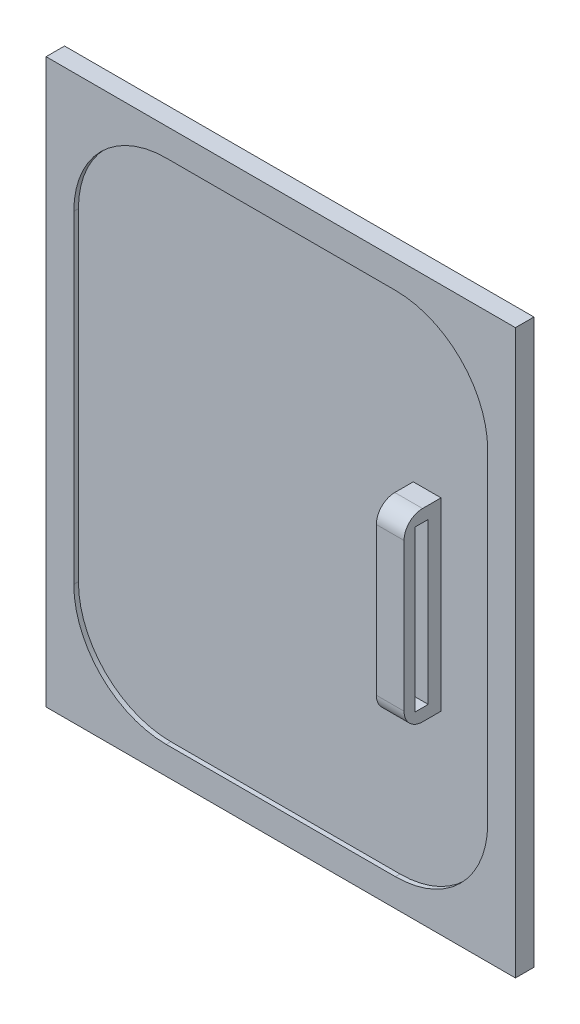
ISO-10303-21;
HEADER;
FILE_DESCRIPTION(('STEP AP214'),'2;1');
FILE_NAME('part.step','',(''),(''),'','','');
FILE_SCHEMA(('AUTOMOTIVE_DESIGN { 1 0 10303 214 1 1 1 1 }'));
ENDSEC;
DATA;
#1=APPLICATION_CONTEXT('core data for automotive mechanical design processes');
#2=APPLICATION_PROTOCOL_DEFINITION('international standard','automotive_design',2000,#1);
#3=PRODUCT_CONTEXT('',#1,'mechanical');
#4=PRODUCT('Part','Part','',(#3));
#5=PRODUCT_RELATED_PRODUCT_CATEGORY('part','',(#4));
#6=PRODUCT_DEFINITION_FORMATION('','',#4);
#7=PRODUCT_DEFINITION_CONTEXT('part definition',#1,'design');
#8=PRODUCT_DEFINITION('design','',#6,#7);
#9=PRODUCT_DEFINITION_SHAPE('','',#8);
#10=(LENGTH_UNIT() NAMED_UNIT(*) SI_UNIT(.MILLI.,.METRE.));
#11=(NAMED_UNIT(*) PLANE_ANGLE_UNIT() SI_UNIT($,.RADIAN.));
#12=(NAMED_UNIT(*) SI_UNIT($,.STERADIAN.) SOLID_ANGLE_UNIT());
#13=UNCERTAINTY_MEASURE_WITH_UNIT(LENGTH_MEASURE(1.E-05),#10,'distance_accuracy_value','');
#14=(GEOMETRIC_REPRESENTATION_CONTEXT(3) GLOBAL_UNCERTAINTY_ASSIGNED_CONTEXT((#13)) GLOBAL_UNIT_ASSIGNED_CONTEXT((#10,
#11,#12)) REPRESENTATION_CONTEXT('',''));
#15=CARTESIAN_POINT('',(0.,0.,0.));
#16=DIRECTION('',(0.,0.,1.));
#17=DIRECTION('',(1.,0.,0.));
#18=AXIS2_PLACEMENT_3D('',#15,#16,#17);
#19=CARTESIAN_POINT('',(-62.0000000000001,-87.4,7.5));
#20=DIRECTION('',(0.,0.,-1.));
#21=DIRECTION('',(-1.,0.,0.));
#22=AXIS2_PLACEMENT_3D('',#19,#20,#21);
#23=PLANE('',#22);
#24=CARTESIAN_POINT('',(-62.0000000000001,-87.4,7.5));
#25=DIRECTION('',(0.,0.,1.));
#26=DIRECTION('',(-1.,0.,0.));
#27=AXIS2_PLACEMENT_3D('',#24,#25,#26);
#28=CIRCLE('',#27,50.);
#29=CARTESIAN_POINT('',(-112.,-87.3999999999997,7.5));
#30=VERTEX_POINT('',#29);
#31=CARTESIAN_POINT('',(-61.9999999999997,-137.4,7.5));
#32=VERTEX_POINT('',#31);
#33=EDGE_CURVE('E247',#30,#32,#28,.T.);
#34=ORIENTED_EDGE('',*,*,#33,.T.);
#35=DIRECTION('',(1.,0.,0.));
#36=VECTOR('',#35,1.);
#37=CARTESIAN_POINT('',(-61.9999999999997,-137.4,7.5));
#38=LINE('',#37,#36);
#39=CARTESIAN_POINT('',(61.9999999999997,-137.4,7.5));
#40=VERTEX_POINT('',#39);
#41=EDGE_CURVE('E250',#32,#40,#38,.T.);
#42=ORIENTED_EDGE('',*,*,#41,.T.);
#43=CARTESIAN_POINT('',(62.,-87.4,7.5));
#44=DIRECTION('',(0.,0.,1.));
#45=DIRECTION('',(1.,0.,0.));
#46=AXIS2_PLACEMENT_3D('',#43,#44,#45);
#47=CIRCLE('',#46,50.);
#48=CARTESIAN_POINT('',(112.,-87.4,7.5));
#49=VERTEX_POINT('',#48);
#50=EDGE_CURVE('E254',#40,#49,#47,.T.);
#51=ORIENTED_EDGE('',*,*,#50,.T.);
#52=DIRECTION('',(0.,1.,0.));
#53=VECTOR('',#52,1.);
#54=CARTESIAN_POINT('',(112.,-87.3999999999997,7.5));
#55=LINE('',#54,#53);
#56=CARTESIAN_POINT('',(112.,87.3999999999997,7.5));
#57=VERTEX_POINT('',#56);
#58=EDGE_CURVE('E257',#49,#57,#55,.T.);
#59=ORIENTED_EDGE('',*,*,#58,.T.);
#60=CARTESIAN_POINT('',(62.,87.4,7.5));
#61=DIRECTION('',(0.,0.,1.));
#62=DIRECTION('',(-1.,0.,0.));
#63=AXIS2_PLACEMENT_3D('',#60,#61,#62);
#64=CIRCLE('',#63,50.);
#65=CARTESIAN_POINT('',(61.9999999999997,137.4,7.5));
#66=VERTEX_POINT('',#65);
#67=EDGE_CURVE('E260',#57,#66,#64,.T.);
#68=ORIENTED_EDGE('',*,*,#67,.T.);
#69=DIRECTION('',(-1.,0.,0.));
#70=VECTOR('',#69,1.);
#71=CARTESIAN_POINT('',(-61.9999999999997,137.4,7.5));
#72=LINE('',#71,#70);
#73=CARTESIAN_POINT('',(-61.9999999999997,137.4,7.5));
#74=VERTEX_POINT('',#73);
#75=EDGE_CURVE('E263',#66,#74,#72,.T.);
#76=ORIENTED_EDGE('',*,*,#75,.T.);
#77=CARTESIAN_POINT('',(-62.0000000000001,87.4,7.5));
#78=DIRECTION('',(0.,0.,1.));
#79=DIRECTION('',(-1.,0.,0.));
#80=AXIS2_PLACEMENT_3D('',#77,#78,#79);
#81=CIRCLE('',#80,50.);
#82=CARTESIAN_POINT('',(-112.,87.3999999999997,7.5));
#83=VERTEX_POINT('',#82);
#84=EDGE_CURVE('E266',#74,#83,#81,.T.);
#85=ORIENTED_EDGE('',*,*,#84,.T.);
#86=DIRECTION('',(0.,-1.,0.));
#87=VECTOR('',#86,1.);
#88=CARTESIAN_POINT('',(-112.,-87.3999999999997,7.5));
#89=LINE('',#88,#87);
#90=EDGE_CURVE('E269',#83,#30,#89,.T.);
#91=ORIENTED_EDGE('',*,*,#90,.T.);
#92=EDGE_LOOP('',(#34,#42,#51,#59,#68,#76,#85,#91));
#93=FACE_BOUND('',#92,.T.);
#94=DIRECTION('',(0.,1.,0.));
#95=VECTOR('',#94,1.);
#96=CARTESIAN_POINT('',(84.2187120964874,-49.9999999999999,7.5));
#97=LINE('',#96,#95);
#98=CARTESIAN_POINT('',(84.2187120964874,-49.9999999999999,7.5));
#99=VERTEX_POINT('',#98);
#100=CARTESIAN_POINT('',(84.2187120964874,50.0000000000001,7.5));
#101=VERTEX_POINT('',#100);
#102=EDGE_CURVE('E220',#99,#101,#97,.T.);
#103=ORIENTED_EDGE('',*,*,#102,.F.);
#104=DIRECTION('',(1.,0.,0.));
#105=VECTOR('',#104,1.);
#106=CARTESIAN_POINT('',(69.2187120964874,-49.9999999999999,7.5));
#107=LINE('',#106,#105);
#108=CARTESIAN_POINT('',(69.2187120964874,-49.9999999999999,7.5));
#109=VERTEX_POINT('',#108);
#110=EDGE_CURVE('E225',#109,#99,#107,.T.);
#111=ORIENTED_EDGE('',*,*,#110,.F.);
#112=DIRECTION('',(0.,-1.,0.));
#113=VECTOR('',#112,1.);
#114=CARTESIAN_POINT('',(69.2187120964874,-49.9999999999999,7.5));
#115=LINE('',#114,#113);
#116=CARTESIAN_POINT('',(69.2187120964874,50.0000000000001,7.5));
#117=VERTEX_POINT('',#116);
#118=EDGE_CURVE('E234',#117,#109,#115,.T.);
#119=ORIENTED_EDGE('',*,*,#118,.F.);
#120=DIRECTION('',(-1.,0.,0.));
#121=VECTOR('',#120,1.);
#122=CARTESIAN_POINT('',(69.2187120964874,50.0000000000001,7.5));
#123=LINE('',#122,#121);
#124=EDGE_CURVE('E231',#101,#117,#123,.T.);
#125=ORIENTED_EDGE('',*,*,#124,.F.);
#126=EDGE_LOOP('',(#103,#111,#119,#125));
#127=FACE_BOUND('',#126,.T.);
#128=ADVANCED_FACE('F39',(#93,#127),#23,.F.);
#129=CARTESIAN_POINT('',(127.,-152.4,10.));
#130=DIRECTION('',(-1.,0.,0.));
#131=DIRECTION('',(0.,0.,1.));
#132=AXIS2_PLACEMENT_3D('',#129,#130,#131);
#133=PLANE('',#132);
#134=DIRECTION('',(0.,1.,0.));
#135=VECTOR('',#134,1.);
#136=CARTESIAN_POINT('',(127.,-152.4,0.));
#137=LINE('',#136,#135);
#138=CARTESIAN_POINT('',(127.,-152.4,0.));
#139=VERTEX_POINT('',#138);
#140=CARTESIAN_POINT('',(127.,152.4,0.));
#141=VERTEX_POINT('',#140);
#142=EDGE_CURVE('E296',#139,#141,#137,.T.);
#143=ORIENTED_EDGE('',*,*,#142,.T.);
#144=DIRECTION('',(0.,0.,-1.));
#145=VECTOR('',#144,1.);
#146=CARTESIAN_POINT('',(127.,152.4,10.));
#147=LINE('',#146,#145);
#148=CARTESIAN_POINT('',(127.,152.4,10.));
#149=VERTEX_POINT('',#148);
#150=EDGE_CURVE('E337',#149,#141,#147,.T.);
#151=ORIENTED_EDGE('',*,*,#150,.F.);
#152=DIRECTION('',(0.,1.,0.));
#153=VECTOR('',#152,1.);
#154=CARTESIAN_POINT('',(127.,-152.4,10.));
#155=LINE('',#154,#153);
#156=CARTESIAN_POINT('',(127.,-152.4,10.));
#157=VERTEX_POINT('',#156);
#158=EDGE_CURVE('E311',#157,#149,#155,.T.);
#159=ORIENTED_EDGE('',*,*,#158,.F.);
#160=DIRECTION('',(0.,0.,-1.));
#161=VECTOR('',#160,1.);
#162=CARTESIAN_POINT('',(127.,-152.4,10.));
#163=LINE('',#162,#161);
#164=EDGE_CURVE('E321',#157,#139,#163,.T.);
#165=ORIENTED_EDGE('',*,*,#164,.T.);
#166=EDGE_LOOP('',(#143,#151,#159,#165));
#167=FACE_BOUND('',#166,.T.);
#168=ADVANCED_FACE('F385',(#167),#133,.F.);
#169=CARTESIAN_POINT('',(-127.,152.4,10.));
#170=DIRECTION('',(0.,-1.,0.));
#171=DIRECTION('',(0.,0.,-1.));
#172=AXIS2_PLACEMENT_3D('',#169,#170,#171);
#173=PLANE('',#172);
#174=DIRECTION('',(-1.,0.,0.));
#175=VECTOR('',#174,1.);
#176=CARTESIAN_POINT('',(-127.,152.4,0.));
#177=LINE('',#176,#175);
#178=CARTESIAN_POINT('',(-127.,152.4,0.));
#179=VERTEX_POINT('',#178);
#180=EDGE_CURVE('E324',#141,#179,#177,.T.);
#181=ORIENTED_EDGE('',*,*,#180,.T.);
#182=DIRECTION('',(0.,0.,-1.));
#183=VECTOR('',#182,1.);
#184=CARTESIAN_POINT('',(-127.,152.4,10.));
#185=LINE('',#184,#183);
#186=CARTESIAN_POINT('',(-127.,152.4,10.));
#187=VERTEX_POINT('',#186);
#188=EDGE_CURVE('E334',#187,#179,#185,.T.);
#189=ORIENTED_EDGE('',*,*,#188,.F.);
#190=DIRECTION('',(-1.,0.,0.));
#191=VECTOR('',#190,1.);
#192=CARTESIAN_POINT('',(-127.,152.4,10.));
#193=LINE('',#192,#191);
#194=EDGE_CURVE('E314',#149,#187,#193,.T.);
#195=ORIENTED_EDGE('',*,*,#194,.F.);
#196=ORIENTED_EDGE('',*,*,#150,.T.);
#197=EDGE_LOOP('',(#181,#189,#195,#196));
#198=FACE_BOUND('',#197,.T.);
#199=ADVANCED_FACE('F393',(#198),#173,.F.);
#200=CARTESIAN_POINT('',(-127.,-152.4,10.));
#201=DIRECTION('',(1.,0.,0.));
#202=DIRECTION('',(0.,0.,-1.));
#203=AXIS2_PLACEMENT_3D('',#200,#201,#202);
#204=PLANE('',#203);
#205=DIRECTION('',(0.,-1.,0.));
#206=VECTOR('',#205,1.);
#207=CARTESIAN_POINT('',(-127.,-152.4,0.));
#208=LINE('',#207,#206);
#209=CARTESIAN_POINT('',(-127.,-152.4,0.));
#210=VERTEX_POINT('',#209);
#211=EDGE_CURVE('E326',#179,#210,#208,.T.);
#212=ORIENTED_EDGE('',*,*,#211,.T.);
#213=DIRECTION('',(0.,0.,-1.));
#214=VECTOR('',#213,1.);
#215=CARTESIAN_POINT('',(-127.,-152.4,10.));
#216=LINE('',#215,#214);
#217=CARTESIAN_POINT('',(-127.,-152.4,10.));
#218=VERTEX_POINT('',#217);
#219=EDGE_CURVE('E331',#218,#210,#216,.T.);
#220=ORIENTED_EDGE('',*,*,#219,.F.);
#221=DIRECTION('',(0.,-1.,0.));
#222=VECTOR('',#221,1.);
#223=CARTESIAN_POINT('',(-127.,-152.4,10.));
#224=LINE('',#223,#222);
#225=EDGE_CURVE('E317',#187,#218,#224,.T.);
#226=ORIENTED_EDGE('',*,*,#225,.F.);
#227=ORIENTED_EDGE('',*,*,#188,.T.);
#228=EDGE_LOOP('',(#212,#220,#226,#227));
#229=FACE_BOUND('',#228,.T.);
#230=ADVANCED_FACE('F441',(#229),#204,.F.);
#231=CARTESIAN_POINT('',(-127.,-152.4,10.));
#232=DIRECTION('',(0.,1.,0.));
#233=DIRECTION('',(0.,0.,1.));
#234=AXIS2_PLACEMENT_3D('',#231,#232,#233);
#235=PLANE('',#234);
#236=DIRECTION('',(1.,0.,0.));
#237=VECTOR('',#236,1.);
#238=CARTESIAN_POINT('',(-127.,-152.4,0.));
#239=LINE('',#238,#237);
#240=EDGE_CURVE('E315',#210,#139,#239,.T.);
#241=ORIENTED_EDGE('',*,*,#240,.T.);
#242=ORIENTED_EDGE('',*,*,#164,.F.);
#243=DIRECTION('',(1.,0.,0.));
#244=VECTOR('',#243,1.);
#245=CARTESIAN_POINT('',(-127.,-152.4,10.));
#246=LINE('',#245,#244);
#247=EDGE_CURVE('E319',#218,#157,#246,.T.);
#248=ORIENTED_EDGE('',*,*,#247,.F.);
#249=ORIENTED_EDGE('',*,*,#219,.T.);
#250=EDGE_LOOP('',(#241,#242,#248,#249));
#251=FACE_BOUND('',#250,.T.);
#252=ADVANCED_FACE('F434',(#251),#235,.F.);
#253=CARTESIAN_POINT('',(0.,0.,10.));
#254=DIRECTION('',(0.,0.,-1.));
#255=DIRECTION('',(-1.,0.,0.));
#256=AXIS2_PLACEMENT_3D('',#253,#254,#255);
#257=PLANE('',#256);
#258=DIRECTION('',(1.,0.,0.));
#259=VECTOR('',#258,1.);
#260=CARTESIAN_POINT('',(-61.9999999999997,-137.4,10.));
#261=LINE('',#260,#259);
#262=CARTESIAN_POINT('',(-61.9999999999997,-137.4,10.));
#263=VERTEX_POINT('',#262);
#264=CARTESIAN_POINT('',(61.9999999999997,-137.4,10.));
#265=VERTEX_POINT('',#264);
#266=EDGE_CURVE('E274',#263,#265,#261,.T.);
#267=ORIENTED_EDGE('',*,*,#266,.F.);
#268=CARTESIAN_POINT('',(-62.0000000000001,-87.4,10.));
#269=DIRECTION('',(0.,0.,1.));
#270=DIRECTION('',(-1.,0.,0.));
#271=AXIS2_PLACEMENT_3D('',#268,#269,#270);
#272=CIRCLE('',#271,50.);
#273=CARTESIAN_POINT('',(-112.,-87.3999999999997,10.));
#274=VERTEX_POINT('',#273);
#275=EDGE_CURVE('E246',#274,#263,#272,.T.);
#276=ORIENTED_EDGE('',*,*,#275,.F.);
#277=DIRECTION('',(0.,-1.,0.));
#278=VECTOR('',#277,1.);
#279=CARTESIAN_POINT('',(-112.,-87.3999999999997,10.));
#280=LINE('',#279,#278);
#281=CARTESIAN_POINT('',(-112.,87.3999999999997,10.));
#282=VERTEX_POINT('',#281);
#283=EDGE_CURVE('E251',#282,#274,#280,.T.);
#284=ORIENTED_EDGE('',*,*,#283,.F.);
#285=CARTESIAN_POINT('',(-62.0000000000001,87.4,10.));
#286=DIRECTION('',(0.,0.,1.));
#287=DIRECTION('',(-1.,0.,0.));
#288=AXIS2_PLACEMENT_3D('',#285,#286,#287);
#289=CIRCLE('',#288,50.);
#290=CARTESIAN_POINT('',(-61.9999999999997,137.4,10.));
#291=VERTEX_POINT('',#290);
#292=EDGE_CURVE('E289',#291,#282,#289,.T.);
#293=ORIENTED_EDGE('',*,*,#292,.F.);
#294=DIRECTION('',(-1.,0.,0.));
#295=VECTOR('',#294,1.);
#296=CARTESIAN_POINT('',(-61.9999999999997,137.4,10.));
#297=LINE('',#296,#295);
#298=CARTESIAN_POINT('',(61.9999999999997,137.4,10.));
#299=VERTEX_POINT('',#298);
#300=EDGE_CURVE('E286',#299,#291,#297,.T.);
#301=ORIENTED_EDGE('',*,*,#300,.F.);
#302=CARTESIAN_POINT('',(62.,87.4,10.));
#303=DIRECTION('',(0.,0.,1.));
#304=DIRECTION('',(-1.,0.,0.));
#305=AXIS2_PLACEMENT_3D('',#302,#303,#304);
#306=CIRCLE('',#305,50.);
#307=CARTESIAN_POINT('',(112.,87.3999999999997,10.));
#308=VERTEX_POINT('',#307);
#309=EDGE_CURVE('E283',#308,#299,#306,.T.);
#310=ORIENTED_EDGE('',*,*,#309,.F.);
#311=DIRECTION('',(0.,1.,0.));
#312=VECTOR('',#311,1.);
#313=CARTESIAN_POINT('',(112.,-87.3999999999997,10.));
#314=LINE('',#313,#312);
#315=CARTESIAN_POINT('',(112.,-87.4,10.));
#316=VERTEX_POINT('',#315);
#317=EDGE_CURVE('E280',#316,#308,#314,.T.);
#318=ORIENTED_EDGE('',*,*,#317,.F.);
#319=CARTESIAN_POINT('',(62.,-87.4,10.));
#320=DIRECTION('',(0.,0.,1.));
#321=DIRECTION('',(1.,0.,0.));
#322=AXIS2_PLACEMENT_3D('',#319,#320,#321);
#323=CIRCLE('',#322,50.);
#324=EDGE_CURVE('E277',#265,#316,#323,.T.);
#325=ORIENTED_EDGE('',*,*,#324,.F.);
#326=EDGE_LOOP('',(#267,#276,#284,#293,#301,#310,#318,#325));
#327=FACE_BOUND('',#326,.T.);
#328=ORIENTED_EDGE('',*,*,#158,.T.);
#329=ORIENTED_EDGE('',*,*,#194,.T.);
#330=ORIENTED_EDGE('',*,*,#225,.T.);
#331=ORIENTED_EDGE('',*,*,#247,.T.);
#332=EDGE_LOOP('',(#328,#329,#330,#331));
#333=FACE_BOUND('',#332,.T.);
#334=ADVANCED_FACE('F431',(#327,#333),#257,.F.);
#335=CARTESIAN_POINT('',(0.,0.,0.));
#336=DIRECTION('',(0.,0.,-1.));
#337=DIRECTION('',(-1.,0.,0.));
#338=AXIS2_PLACEMENT_3D('',#335,#336,#337);
#339=PLANE('',#338);
#340=ORIENTED_EDGE('',*,*,#142,.F.);
#341=ORIENTED_EDGE('',*,*,#240,.F.);
#342=ORIENTED_EDGE('',*,*,#211,.F.);
#343=ORIENTED_EDGE('',*,*,#180,.F.);
#344=EDGE_LOOP('',(#340,#341,#342,#343));
#345=FACE_BOUND('',#344,.T.);
#346=ADVANCED_FACE('F429',(#345),#339,.T.);
#347=CARTESIAN_POINT('',(-62.0000000000001,-87.4,7.5));
#348=DIRECTION('',(0.,0.,1.));
#349=DIRECTION('',(1.,0.,0.));
#350=AXIS2_PLACEMENT_3D('',#347,#348,#349);
#351=CYLINDRICAL_SURFACE('',#350,50.);
#352=ORIENTED_EDGE('',*,*,#275,.T.);
#353=DIRECTION('',(0.,0.,1.));
#354=VECTOR('',#353,1.);
#355=CARTESIAN_POINT('',(-61.9999999999997,-137.4,7.5));
#356=LINE('',#355,#354);
#357=EDGE_CURVE('E272',#32,#263,#356,.T.);
#358=ORIENTED_EDGE('',*,*,#357,.F.);
#359=ORIENTED_EDGE('',*,*,#33,.F.);
#360=DIRECTION('',(0.,0.,1.));
#361=VECTOR('',#360,1.);
#362=CARTESIAN_POINT('',(-112.,-87.3999999999997,7.5));
#363=LINE('',#362,#361);
#364=EDGE_CURVE('E294',#30,#274,#363,.T.);
#365=ORIENTED_EDGE('',*,*,#364,.T.);
#366=EDGE_LOOP('',(#352,#358,#359,#365));
#367=FACE_BOUND('',#366,.T.);
#368=ADVANCED_FACE('F403',(#367),#351,.F.);
#369=CARTESIAN_POINT('',(-112.,-87.3999999999997,7.5));
#370=DIRECTION('',(-1.,0.,0.));
#371=DIRECTION('',(0.,0.,1.));
#372=AXIS2_PLACEMENT_3D('',#369,#370,#371);
#373=PLANE('',#372);
#374=ORIENTED_EDGE('',*,*,#283,.T.);
#375=ORIENTED_EDGE('',*,*,#364,.F.);
#376=ORIENTED_EDGE('',*,*,#90,.F.);
#377=DIRECTION('',(0.,0.,1.));
#378=VECTOR('',#377,1.);
#379=CARTESIAN_POINT('',(-112.,87.3999999999997,7.5));
#380=LINE('',#379,#378);
#381=EDGE_CURVE('E297',#83,#282,#380,.T.);
#382=ORIENTED_EDGE('',*,*,#381,.T.);
#383=EDGE_LOOP('',(#374,#375,#376,#382));
#384=FACE_BOUND('',#383,.T.);
#385=ADVANCED_FACE('F399',(#384),#373,.F.);
#386=CARTESIAN_POINT('',(-62.0000000000001,87.4,7.5));
#387=DIRECTION('',(0.,0.,1.));
#388=DIRECTION('',(1.,0.,0.));
#389=AXIS2_PLACEMENT_3D('',#386,#387,#388);
#390=CYLINDRICAL_SURFACE('',#389,50.);
#391=ORIENTED_EDGE('',*,*,#292,.T.);
#392=ORIENTED_EDGE('',*,*,#381,.F.);
#393=ORIENTED_EDGE('',*,*,#84,.F.);
#394=DIRECTION('',(0.,0.,1.));
#395=VECTOR('',#394,1.);
#396=CARTESIAN_POINT('',(-61.9999999999997,137.4,7.5));
#397=LINE('',#396,#395);
#398=EDGE_CURVE('E299',#74,#291,#397,.T.);
#399=ORIENTED_EDGE('',*,*,#398,.T.);
#400=EDGE_LOOP('',(#391,#392,#393,#399));
#401=FACE_BOUND('',#400,.T.);
#402=ADVANCED_FACE('F402',(#401),#390,.F.);
#403=CARTESIAN_POINT('',(-61.9999999999997,137.4,7.5));
#404=DIRECTION('',(0.,1.,0.));
#405=DIRECTION('',(0.,0.,1.));
#406=AXIS2_PLACEMENT_3D('',#403,#404,#405);
#407=PLANE('',#406);
#408=ORIENTED_EDGE('',*,*,#300,.T.);
#409=ORIENTED_EDGE('',*,*,#398,.F.);
#410=ORIENTED_EDGE('',*,*,#75,.F.);
#411=DIRECTION('',(0.,0.,1.));
#412=VECTOR('',#411,1.);
#413=CARTESIAN_POINT('',(61.9999999999997,137.4,7.5));
#414=LINE('',#413,#412);
#415=EDGE_CURVE('E301',#66,#299,#414,.T.);
#416=ORIENTED_EDGE('',*,*,#415,.T.);
#417=EDGE_LOOP('',(#408,#409,#410,#416));
#418=FACE_BOUND('',#417,.T.);
#419=ADVANCED_FACE('F407',(#418),#407,.F.);
#420=CARTESIAN_POINT('',(62.,87.4,7.5));
#421=DIRECTION('',(0.,0.,1.));
#422=DIRECTION('',(1.,0.,0.));
#423=AXIS2_PLACEMENT_3D('',#420,#421,#422);
#424=CYLINDRICAL_SURFACE('',#423,50.);
#425=ORIENTED_EDGE('',*,*,#309,.T.);
#426=ORIENTED_EDGE('',*,*,#415,.F.);
#427=ORIENTED_EDGE('',*,*,#67,.F.);
#428=DIRECTION('',(0.,0.,1.));
#429=VECTOR('',#428,1.);
#430=CARTESIAN_POINT('',(112.,87.3999999999997,7.5));
#431=LINE('',#430,#429);
#432=EDGE_CURVE('E303',#57,#308,#431,.T.);
#433=ORIENTED_EDGE('',*,*,#432,.T.);
#434=EDGE_LOOP('',(#425,#426,#427,#433));
#435=FACE_BOUND('',#434,.T.);
#436=ADVANCED_FACE('F411',(#435),#424,.F.);
#437=CARTESIAN_POINT('',(112.,-87.3999999999997,7.5));
#438=DIRECTION('',(1.,0.,0.));
#439=DIRECTION('',(0.,0.,-1.));
#440=AXIS2_PLACEMENT_3D('',#437,#438,#439);
#441=PLANE('',#440);
#442=ORIENTED_EDGE('',*,*,#317,.T.);
#443=ORIENTED_EDGE('',*,*,#432,.F.);
#444=ORIENTED_EDGE('',*,*,#58,.F.);
#445=DIRECTION('',(0.,0.,1.));
#446=VECTOR('',#445,1.);
#447=CARTESIAN_POINT('',(112.,-87.4,7.5));
#448=LINE('',#447,#446);
#449=EDGE_CURVE('E305',#49,#316,#448,.T.);
#450=ORIENTED_EDGE('',*,*,#449,.T.);
#451=EDGE_LOOP('',(#442,#443,#444,#450));
#452=FACE_BOUND('',#451,.T.);
#453=ADVANCED_FACE('F415',(#452),#441,.F.);
#454=CARTESIAN_POINT('',(62.,-87.4,7.5));
#455=DIRECTION('',(0.,0.,1.));
#456=DIRECTION('',(1.,0.,0.));
#457=AXIS2_PLACEMENT_3D('',#454,#455,#456);
#458=CYLINDRICAL_SURFACE('',#457,50.);
#459=ORIENTED_EDGE('',*,*,#324,.T.);
#460=ORIENTED_EDGE('',*,*,#449,.F.);
#461=ORIENTED_EDGE('',*,*,#50,.F.);
#462=DIRECTION('',(0.,0.,1.));
#463=VECTOR('',#462,1.);
#464=CARTESIAN_POINT('',(61.9999999999997,-137.4,7.5));
#465=LINE('',#464,#463);
#466=EDGE_CURVE('E307',#40,#265,#465,.T.);
#467=ORIENTED_EDGE('',*,*,#466,.T.);
#468=EDGE_LOOP('',(#459,#460,#461,#467));
#469=FACE_BOUND('',#468,.T.);
#470=ADVANCED_FACE('F419',(#469),#458,.F.);
#471=CARTESIAN_POINT('',(-61.9999999999997,-137.4,7.5));
#472=DIRECTION('',(0.,-1.,0.));
#473=DIRECTION('',(0.,0.,-1.));
#474=AXIS2_PLACEMENT_3D('',#471,#472,#473);
#475=PLANE('',#474);
#476=ORIENTED_EDGE('',*,*,#266,.T.);
#477=ORIENTED_EDGE('',*,*,#466,.F.);
#478=ORIENTED_EDGE('',*,*,#41,.F.);
#479=ORIENTED_EDGE('',*,*,#357,.T.);
#480=EDGE_LOOP('',(#476,#477,#478,#479));
#481=FACE_BOUND('',#480,.T.);
#482=ADVANCED_FACE('F423',(#481),#475,.F.);
#483=CARTESIAN_POINT('',(84.2187120964874,-49.9999999999999,27.5));
#484=DIRECTION('',(-1.,0.,0.));
#485=DIRECTION('',(0.,0.,1.));
#486=AXIS2_PLACEMENT_3D('',#483,#484,#485);
#487=PLANE('',#486);
#488=DIRECTION('',(0.,-1.,0.));
#489=VECTOR('',#488,1.);
#490=CARTESIAN_POINT('',(84.2187120964874,-49.9999999999999,14.4186911342459));
#491=LINE('',#490,#489);
#492=CARTESIAN_POINT('',(84.2187120964874,43.3464578864568,14.4186911342459));
#493=VERTEX_POINT('',#492);
#494=CARTESIAN_POINT('',(84.2187120964874,-43.3464578864568,14.4186911342459));
#495=VERTEX_POINT('',#494);
#496=EDGE_CURVE('E187',#493,#495,#491,.T.);
#497=ORIENTED_EDGE('',*,*,#496,.T.);
#498=DIRECTION('',(0.,0.,1.));
#499=VECTOR('',#498,1.);
#500=CARTESIAN_POINT('',(84.2187120964874,-43.3464578864568,27.5));
#501=LINE('',#500,#499);
#502=CARTESIAN_POINT('',(84.2187120964874,-43.3464578864568,21.6109989558207));
#503=VERTEX_POINT('',#502);
#504=EDGE_CURVE('E215',#495,#503,#501,.T.);
#505=ORIENTED_EDGE('',*,*,#504,.T.);
#506=DIRECTION('',(0.,-1.,0.));
#507=VECTOR('',#506,1.);
#508=CARTESIAN_POINT('',(84.2187120964874,-49.9999999999999,21.6109989558207));
#509=LINE('',#508,#507);
#510=CARTESIAN_POINT('',(84.2187120964874,43.3464578864568,21.6109989558207));
#511=VERTEX_POINT('',#510);
#512=EDGE_CURVE('E213',#511,#503,#509,.T.);
#513=ORIENTED_EDGE('',*,*,#512,.F.);
#514=DIRECTION('',(0.,0.,1.));
#515=VECTOR('',#514,1.);
#516=CARTESIAN_POINT('',(84.2187120964874,43.3464578864568,27.5));
#517=LINE('',#516,#515);
#518=EDGE_CURVE('E198',#493,#511,#517,.T.);
#519=ORIENTED_EDGE('',*,*,#518,.F.);
#520=EDGE_LOOP('',(#497,#505,#513,#519));
#521=FACE_BOUND('',#520,.T.);
#522=DIRECTION('',(0.,1.,0.));
#523=VECTOR('',#522,1.);
#524=CARTESIAN_POINT('',(84.2187120964874,-49.9999999999999,27.5));
#525=LINE('',#524,#523);
#526=CARTESIAN_POINT('',(84.2187120964874,-39.9999999999999,27.5));
#527=VERTEX_POINT('',#526);
#528=CARTESIAN_POINT('',(84.2187120964874,40.0000000000001,27.5));
#529=VERTEX_POINT('',#528);
#530=EDGE_CURVE('E221',#527,#529,#525,.T.);
#531=ORIENTED_EDGE('',*,*,#530,.F.);
#532=CARTESIAN_POINT('',(84.2187120964874,-39.9999999999999,17.5));
#533=DIRECTION('',(-1.,0.,0.));
#534=DIRECTION('',(0.,0.,1.));
#535=AXIS2_PLACEMENT_3D('',#532,#533,#534);
#536=CIRCLE('',#535,10.);
#537=CARTESIAN_POINT('',(84.2187120964874,-49.9999999999999,17.5));
#538=VERTEX_POINT('',#537);
#539=EDGE_CURVE('E356',#527,#538,#536,.F.);
#540=ORIENTED_EDGE('',*,*,#539,.T.);
#541=DIRECTION('',(0.,0.,-1.));
#542=VECTOR('',#541,1.);
#543=CARTESIAN_POINT('',(84.2187120964874,-49.9999999999999,27.5));
#544=LINE('',#543,#542);
#545=EDGE_CURVE('E228',#538,#99,#544,.T.);
#546=ORIENTED_EDGE('',*,*,#545,.T.);
#547=ORIENTED_EDGE('',*,*,#102,.T.);
#548=DIRECTION('',(0.,0.,-1.));
#549=VECTOR('',#548,1.);
#550=CARTESIAN_POINT('',(84.2187120964874,50.0000000000001,27.5));
#551=LINE('',#550,#549);
#552=CARTESIAN_POINT('',(84.2187120964874,50.0000000000001,17.5));
#553=VERTEX_POINT('',#552);
#554=EDGE_CURVE('E244',#553,#101,#551,.T.);
#555=ORIENTED_EDGE('',*,*,#554,.F.);
#556=CARTESIAN_POINT('',(84.2187120964874,40.0000000000001,17.5));
#557=DIRECTION('',(-1.,0.,0.));
#558=DIRECTION('',(0.,0.,1.));
#559=AXIS2_PLACEMENT_3D('',#556,#557,#558);
#560=CIRCLE('',#559,10.);
#561=EDGE_CURVE('E354',#553,#529,#560,.F.);
#562=ORIENTED_EDGE('',*,*,#561,.T.);
#563=EDGE_LOOP('',(#531,#540,#546,#547,#555,#562));
#564=FACE_BOUND('',#563,.T.);
#565=ADVANCED_FACE('F211',(#521,#564),#487,.F.);
#566=CARTESIAN_POINT('',(69.2187120964874,50.0000000000001,27.5));
#567=DIRECTION('',(0.,-1.,0.));
#568=DIRECTION('',(1.,0.,0.));
#569=AXIS2_PLACEMENT_3D('',#566,#567,#568);
#570=PLANE('',#569);
#571=DIRECTION('',(0.,0.,-1.));
#572=VECTOR('',#571,1.);
#573=CARTESIAN_POINT('',(69.2187120964874,50.0000000000001,27.5));
#574=LINE('',#573,#572);
#575=CARTESIAN_POINT('',(69.2187120964874,50.0000000000001,17.5));
#576=VERTEX_POINT('',#575);
#577=EDGE_CURVE('E242',#576,#117,#574,.T.);
#578=ORIENTED_EDGE('',*,*,#577,.F.);
#579=DIRECTION('',(-1.,0.,0.));
#580=VECTOR('',#579,1.);
#581=CARTESIAN_POINT('',(69.2187120964874,50.0000000000001,17.5));
#582=LINE('',#581,#580);
#583=EDGE_CURVE('E11',#576,#553,#582,.F.);
#584=ORIENTED_EDGE('',*,*,#583,.T.);
#585=ORIENTED_EDGE('',*,*,#554,.T.);
#586=ORIENTED_EDGE('',*,*,#124,.T.);
#587=EDGE_LOOP('',(#578,#584,#585,#586));
#588=FACE_BOUND('',#587,.T.);
#589=ADVANCED_FACE('F376',(#588),#570,.F.);
#590=CARTESIAN_POINT('',(69.2187120964874,-49.9999999999999,27.5));
#591=DIRECTION('',(1.,0.,0.));
#592=DIRECTION('',(0.,0.,-1.));
#593=AXIS2_PLACEMENT_3D('',#590,#591,#592);
#594=PLANE('',#593);
#595=DIRECTION('',(0.,1.,0.));
#596=VECTOR('',#595,1.);
#597=CARTESIAN_POINT('',(69.2187120964874,-49.9999999999999,21.6109989558207));
#598=LINE('',#597,#596);
#599=CARTESIAN_POINT('',(69.2187120964874,-43.3464578864568,21.6109989558207));
#600=VERTEX_POINT('',#599);
#601=CARTESIAN_POINT('',(69.2187120964874,43.3464578864568,21.6109989558207));
#602=VERTEX_POINT('',#601);
#603=EDGE_CURVE('E343',#600,#602,#598,.T.);
#604=ORIENTED_EDGE('',*,*,#603,.F.);
#605=DIRECTION('',(0.,0.,-1.));
#606=VECTOR('',#605,1.);
#607=CARTESIAN_POINT('',(69.2187120964874,-43.3464578864568,27.5));
#608=LINE('',#607,#606);
#609=CARTESIAN_POINT('',(69.2187120964874,-43.3464578864568,14.4186911342459));
#610=VERTEX_POINT('',#609);
#611=EDGE_CURVE('E345',#600,#610,#608,.T.);
#612=ORIENTED_EDGE('',*,*,#611,.T.);
#613=DIRECTION('',(0.,1.,0.));
#614=VECTOR('',#613,1.);
#615=CARTESIAN_POINT('',(69.2187120964874,-49.9999999999999,14.4186911342459));
#616=LINE('',#615,#614);
#617=CARTESIAN_POINT('',(69.2187120964874,43.3464578864568,14.4186911342459));
#618=VERTEX_POINT('',#617);
#619=EDGE_CURVE('E340',#610,#618,#616,.T.);
#620=ORIENTED_EDGE('',*,*,#619,.T.);
#621=DIRECTION('',(0.,0.,-1.));
#622=VECTOR('',#621,1.);
#623=CARTESIAN_POINT('',(69.2187120964874,43.3464578864568,27.5));
#624=LINE('',#623,#622);
#625=EDGE_CURVE('E206',#602,#618,#624,.T.);
#626=ORIENTED_EDGE('',*,*,#625,.F.);
#627=EDGE_LOOP('',(#604,#612,#620,#626));
#628=FACE_BOUND('',#627,.T.);
#629=DIRECTION('',(0.,0.,-1.));
#630=VECTOR('',#629,1.);
#631=CARTESIAN_POINT('',(69.2187120964874,-49.9999999999999,27.5));
#632=LINE('',#631,#630);
#633=CARTESIAN_POINT('',(69.2187120964874,-49.9999999999999,17.5));
#634=VERTEX_POINT('',#633);
#635=EDGE_CURVE('E240',#634,#109,#632,.T.);
#636=ORIENTED_EDGE('',*,*,#635,.F.);
#637=CARTESIAN_POINT('',(69.2187120964874,-39.9999999999999,17.5));
#638=DIRECTION('',(1.,0.,0.));
#639=DIRECTION('',(0.,0.,-1.));
#640=AXIS2_PLACEMENT_3D('',#637,#638,#639);
#641=CIRCLE('',#640,10.);
#642=CARTESIAN_POINT('',(69.2187120964874,-39.9999999999999,27.5));
#643=VERTEX_POINT('',#642);
#644=EDGE_CURVE('E47',#634,#643,#641,.F.);
#645=ORIENTED_EDGE('',*,*,#644,.T.);
#646=DIRECTION('',(0.,-1.,0.));
#647=VECTOR('',#646,1.);
#648=CARTESIAN_POINT('',(69.2187120964874,-49.9999999999999,27.5));
#649=LINE('',#648,#647);
#650=CARTESIAN_POINT('',(69.2187120964874,40.0000000000001,27.5));
#651=VERTEX_POINT('',#650);
#652=EDGE_CURVE('E224',#651,#643,#649,.T.);
#653=ORIENTED_EDGE('',*,*,#652,.F.);
#654=CARTESIAN_POINT('',(69.2187120964874,40.0000000000001,17.5));
#655=DIRECTION('',(1.,0.,0.));
#656=DIRECTION('',(0.,0.,-1.));
#657=AXIS2_PLACEMENT_3D('',#654,#655,#656);
#658=CIRCLE('',#657,10.);
#659=EDGE_CURVE('E54',#651,#576,#658,.F.);
#660=ORIENTED_EDGE('',*,*,#659,.T.);
#661=ORIENTED_EDGE('',*,*,#577,.T.);
#662=ORIENTED_EDGE('',*,*,#118,.T.);
#663=EDGE_LOOP('',(#636,#645,#653,#660,#661,#662));
#664=FACE_BOUND('',#663,.T.);
#665=ADVANCED_FACE('F360',(#628,#664),#594,.F.);
#666=CARTESIAN_POINT('',(69.2187120964874,-49.9999999999999,27.5));
#667=DIRECTION('',(0.,1.,0.));
#668=DIRECTION('',(0.,0.,1.));
#669=AXIS2_PLACEMENT_3D('',#666,#667,#668);
#670=PLANE('',#669);
#671=ORIENTED_EDGE('',*,*,#545,.F.);
#672=DIRECTION('',(1.,0.,0.));
#673=VECTOR('',#672,1.);
#674=CARTESIAN_POINT('',(69.2187120964874,-49.9999999999999,17.5));
#675=LINE('',#674,#673);
#676=EDGE_CURVE('E62',#538,#634,#675,.F.);
#677=ORIENTED_EDGE('',*,*,#676,.T.);
#678=ORIENTED_EDGE('',*,*,#635,.T.);
#679=ORIENTED_EDGE('',*,*,#110,.T.);
#680=EDGE_LOOP('',(#671,#677,#678,#679));
#681=FACE_BOUND('',#680,.T.);
#682=ADVANCED_FACE('F369',(#681),#670,.F.);
#683=CARTESIAN_POINT('',(0.,0.,27.5));
#684=DIRECTION('',(0.,0.,-1.));
#685=DIRECTION('',(-1.,0.,0.));
#686=AXIS2_PLACEMENT_3D('',#683,#684,#685);
#687=PLANE('',#686);
#688=ORIENTED_EDGE('',*,*,#652,.T.);
#689=DIRECTION('',(1.,0.,0.));
#690=VECTOR('',#689,1.);
#691=CARTESIAN_POINT('',(0.,-39.9999999999999,27.5));
#692=LINE('',#691,#690);
#693=EDGE_CURVE('E351',#643,#527,#692,.T.);
#694=ORIENTED_EDGE('',*,*,#693,.T.);
#695=ORIENTED_EDGE('',*,*,#530,.T.);
#696=DIRECTION('',(-1.,0.,0.));
#697=VECTOR('',#696,1.);
#698=CARTESIAN_POINT('',(0.,40.,27.5));
#699=LINE('',#698,#697);
#700=EDGE_CURVE('E348',#529,#651,#699,.T.);
#701=ORIENTED_EDGE('',*,*,#700,.T.);
#702=EDGE_LOOP('',(#688,#694,#695,#701));
#703=FACE_BOUND('',#702,.T.);
#704=ADVANCED_FACE('F364',(#703),#687,.F.);
#705=CARTESIAN_POINT('',(-127.,-43.3464578864568,21.6109989558207));
#706=DIRECTION('',(0.,-1.,0.));
#707=DIRECTION('',(0.,0.,-1.));
#708=AXIS2_PLACEMENT_3D('',#705,#706,#707);
#709=PLANE('',#708);
#710=DIRECTION('',(1.,0.,0.));
#711=VECTOR('',#710,1.);
#712=CARTESIAN_POINT('',(-127.,-43.3464578864568,14.4186911342459));
#713=LINE('',#712,#711);
#714=EDGE_CURVE('E193',#610,#495,#713,.T.);
#715=ORIENTED_EDGE('',*,*,#714,.F.);
#716=ORIENTED_EDGE('',*,*,#611,.F.);
#717=DIRECTION('',(1.,0.,0.));
#718=VECTOR('',#717,1.);
#719=CARTESIAN_POINT('',(-127.,-43.3464578864568,21.6109989558207));
#720=LINE('',#719,#718);
#721=EDGE_CURVE('E199',#600,#503,#720,.T.);
#722=ORIENTED_EDGE('',*,*,#721,.T.);
#723=ORIENTED_EDGE('',*,*,#504,.F.);
#724=EDGE_LOOP('',(#715,#716,#722,#723));
#725=FACE_BOUND('',#724,.T.);
#726=ADVANCED_FACE('F569',(#725),#709,.F.);
#727=CARTESIAN_POINT('',(-127.,-43.3464578864568,21.6109989558207));
#728=DIRECTION('',(0.,0.,-1.));
#729=DIRECTION('',(-1.,0.,0.));
#730=AXIS2_PLACEMENT_3D('',#727,#728,#729);
#731=PLANE('',#730);
#732=ORIENTED_EDGE('',*,*,#512,.T.);
#733=ORIENTED_EDGE('',*,*,#721,.F.);
#734=ORIENTED_EDGE('',*,*,#603,.T.);
#735=DIRECTION('',(1.,0.,0.));
#736=VECTOR('',#735,1.);
#737=CARTESIAN_POINT('',(-127.,43.3464578864568,21.6109989558207));
#738=LINE('',#737,#736);
#739=EDGE_CURVE('E208',#602,#511,#738,.T.);
#740=ORIENTED_EDGE('',*,*,#739,.T.);
#741=EDGE_LOOP('',(#732,#733,#734,#740));
#742=FACE_BOUND('',#741,.T.);
#743=ADVANCED_FACE('F577',(#742),#731,.T.);
#744=CARTESIAN_POINT('',(-127.,43.3464578864568,21.6109989558207));
#745=DIRECTION('',(0.,-1.,0.));
#746=DIRECTION('',(0.,0.,-1.));
#747=AXIS2_PLACEMENT_3D('',#744,#745,#746);
#748=PLANE('',#747);
#749=ORIENTED_EDGE('',*,*,#518,.T.);
#750=ORIENTED_EDGE('',*,*,#739,.F.);
#751=ORIENTED_EDGE('',*,*,#625,.T.);
#752=DIRECTION('',(1.,0.,0.));
#753=VECTOR('',#752,1.);
#754=CARTESIAN_POINT('',(-127.,43.3464578864568,14.4186911342459));
#755=LINE('',#754,#753);
#756=EDGE_CURVE('E190',#618,#493,#755,.T.);
#757=ORIENTED_EDGE('',*,*,#756,.T.);
#758=EDGE_LOOP('',(#749,#750,#751,#757));
#759=FACE_BOUND('',#758,.T.);
#760=ADVANCED_FACE('F202',(#759),#748,.T.);
#761=CARTESIAN_POINT('',(-127.,-43.3464578864568,14.4186911342459));
#762=DIRECTION('',(0.,0.,-1.));
#763=DIRECTION('',(-1.,0.,0.));
#764=AXIS2_PLACEMENT_3D('',#761,#762,#763);
#765=PLANE('',#764);
#766=ORIENTED_EDGE('',*,*,#756,.F.);
#767=ORIENTED_EDGE('',*,*,#619,.F.);
#768=ORIENTED_EDGE('',*,*,#714,.T.);
#769=ORIENTED_EDGE('',*,*,#496,.F.);
#770=EDGE_LOOP('',(#766,#767,#768,#769));
#771=FACE_BOUND('',#770,.T.);
#772=ADVANCED_FACE('F189',(#771),#765,.F.);
#773=CARTESIAN_POINT('',(0.,-39.9999999999999,17.5));
#774=DIRECTION('',(1.,0.,0.));
#775=DIRECTION('',(0.,0.,-1.));
#776=AXIS2_PLACEMENT_3D('',#773,#774,#775);
#777=CYLINDRICAL_SURFACE('',#776,10.);
#778=ORIENTED_EDGE('',*,*,#644,.F.);
#779=ORIENTED_EDGE('',*,*,#676,.F.);
#780=ORIENTED_EDGE('',*,*,#539,.F.);
#781=ORIENTED_EDGE('',*,*,#693,.F.);
#782=EDGE_LOOP('',(#778,#779,#780,#781));
#783=FACE_BOUND('',#782,.T.);
#784=ADVANCED_FACE('F367',(#783),#777,.T.);
#785=CARTESIAN_POINT('',(0.,40.,17.5));
#786=DIRECTION('',(-1.,0.,0.));
#787=DIRECTION('',(0.,-1.,0.));
#788=AXIS2_PLACEMENT_3D('',#785,#786,#787);
#789=CYLINDRICAL_SURFACE('',#788,10.);
#790=ORIENTED_EDGE('',*,*,#561,.F.);
#791=ORIENTED_EDGE('',*,*,#583,.F.);
#792=ORIENTED_EDGE('',*,*,#659,.F.);
#793=ORIENTED_EDGE('',*,*,#700,.F.);
#794=EDGE_LOOP('',(#790,#791,#792,#793));
#795=FACE_BOUND('',#794,.T.);
#796=ADVANCED_FACE('F41',(#795),#789,.T.);
#797=CLOSED_SHELL('',(#128,#168,#199,#230,#252,#334,#346,#368,#385,#402,#419,#436,#453,#470,
#482,#565,#589,#665,#682,#704,#726,#743,#760,#772,#784,#796));
#798=MANIFOLD_SOLID_BREP('B2',#797);
#799=ADVANCED_BREP_SHAPE_REPRESENTATION('',(#18,#798),#14);
#800=SHAPE_DEFINITION_REPRESENTATION(#9,#799);
ENDSEC;
END-ISO-10303-21;
